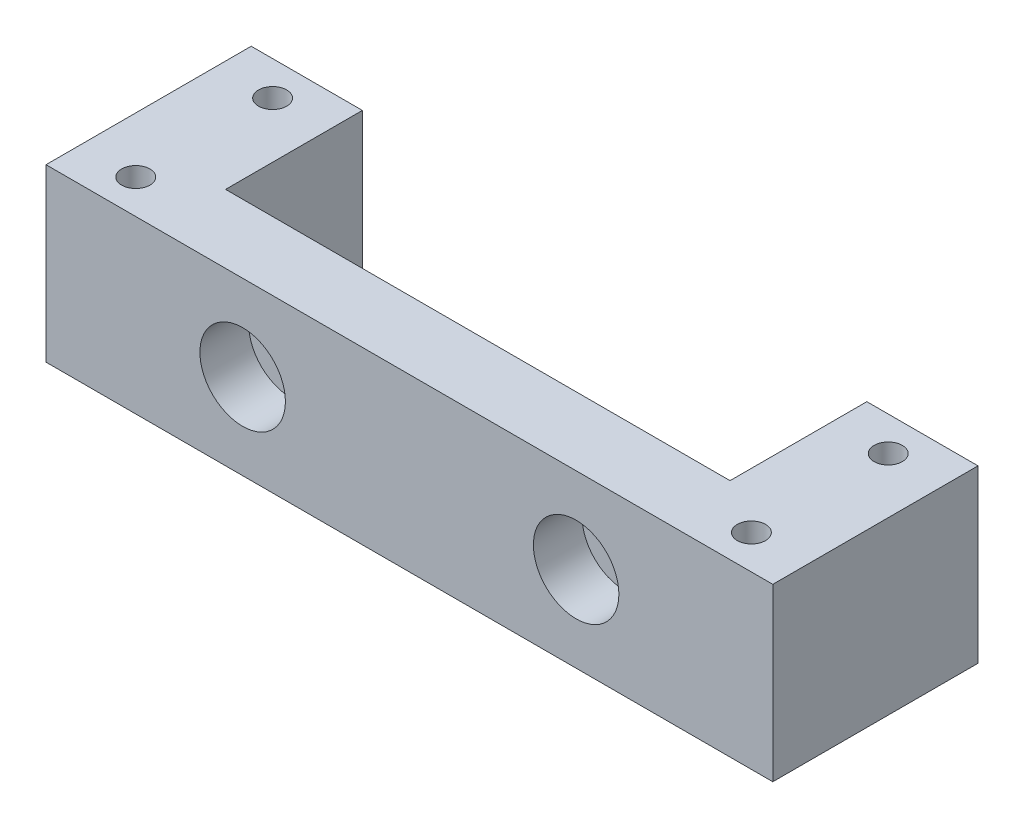
ISO-10303-21;
HEADER;
FILE_DESCRIPTION(('STEP AP214'),'2;1');
FILE_NAME('part.step','',(''),(''),'','','');
FILE_SCHEMA(('AUTOMOTIVE_DESIGN { 1 0 10303 214 1 1 1 1 }'));
ENDSEC;
DATA;
#1=APPLICATION_CONTEXT('core data for automotive mechanical design processes');
#2=APPLICATION_PROTOCOL_DEFINITION('international standard','automotive_design',2000,#1);
#3=PRODUCT_CONTEXT('',#1,'mechanical');
#4=PRODUCT('Part','Part','',(#3));
#5=PRODUCT_RELATED_PRODUCT_CATEGORY('part','',(#4));
#6=PRODUCT_DEFINITION_FORMATION('','',#4);
#7=PRODUCT_DEFINITION_CONTEXT('part definition',#1,'design');
#8=PRODUCT_DEFINITION('design','',#6,#7);
#9=PRODUCT_DEFINITION_SHAPE('','',#8);
#10=(LENGTH_UNIT() NAMED_UNIT(*) SI_UNIT(.MILLI.,.METRE.));
#11=(NAMED_UNIT(*) PLANE_ANGLE_UNIT() SI_UNIT($,.RADIAN.));
#12=(NAMED_UNIT(*) SI_UNIT($,.STERADIAN.) SOLID_ANGLE_UNIT());
#13=UNCERTAINTY_MEASURE_WITH_UNIT(LENGTH_MEASURE(1.E-05),#10,'distance_accuracy_value','');
#14=(GEOMETRIC_REPRESENTATION_CONTEXT(3) GLOBAL_UNCERTAINTY_ASSIGNED_CONTEXT((#13)) GLOBAL_UNIT_ASSIGNED_CONTEXT((#10,
#11,#12)) REPRESENTATION_CONTEXT('',''));
#15=CARTESIAN_POINT('',(0.,0.,0.));
#16=DIRECTION('',(0.,0.,1.));
#17=DIRECTION('',(1.,0.,0.));
#18=AXIS2_PLACEMENT_3D('',#15,#16,#17);
#19=CARTESIAN_POINT('',(0.,0.,0.));
#20=DIRECTION('',(0.,1.,0.));
#21=DIRECTION('',(0.,0.,1.));
#22=AXIS2_PLACEMENT_3D('',#19,#20,#21);
#23=PLANE('',#22);
#24=DIRECTION('',(0.,0.,-1.));
#25=VECTOR('',#24,1.);
#26=CARTESIAN_POINT('',(42.5000000000001,0.,-24.));
#27=LINE('',#26,#25);
#28=CARTESIAN_POINT('',(42.5000000000001,0.,0.));
#29=VERTEX_POINT('',#28);
#30=CARTESIAN_POINT('',(42.5000000000001,0.,-24.));
#31=VERTEX_POINT('',#30);
#32=EDGE_CURVE('E145',#29,#31,#27,.T.);
#33=ORIENTED_EDGE('',*,*,#32,.F.);
#34=DIRECTION('',(1.,0.,0.));
#35=VECTOR('',#34,1.);
#36=CARTESIAN_POINT('',(-42.5000000000001,0.,0.));
#37=LINE('',#36,#35);
#38=CARTESIAN_POINT('',(-42.5000000000001,0.,0.));
#39=VERTEX_POINT('',#38);
#40=EDGE_CURVE('E100',#39,#29,#37,.T.);
#41=ORIENTED_EDGE('',*,*,#40,.F.);
#42=DIRECTION('',(0.,0.,1.));
#43=VECTOR('',#42,1.);
#44=CARTESIAN_POINT('',(-42.5000000000001,0.,-24.));
#45=LINE('',#44,#43);
#46=CARTESIAN_POINT('',(-42.5000000000001,0.,-24.));
#47=VERTEX_POINT('',#46);
#48=EDGE_CURVE('E94',#47,#39,#45,.T.);
#49=ORIENTED_EDGE('',*,*,#48,.F.);
#50=DIRECTION('',(-1.,0.,0.));
#51=VECTOR('',#50,1.);
#52=CARTESIAN_POINT('',(-42.5000000000001,0.,-24.));
#53=LINE('',#52,#51);
#54=CARTESIAN_POINT('',(-29.5000000000001,0.,-24.));
#55=VERTEX_POINT('',#54);
#56=EDGE_CURVE('E135',#55,#47,#53,.T.);
#57=ORIENTED_EDGE('',*,*,#56,.F.);
#58=DIRECTION('',(0.,0.,-1.));
#59=VECTOR('',#58,1.);
#60=CARTESIAN_POINT('',(-29.5000000000001,0.,-8.00000000000001));
#61=LINE('',#60,#59);
#62=CARTESIAN_POINT('',(-29.5000000000001,0.,-8.00000000000001));
#63=VERTEX_POINT('',#62);
#64=EDGE_CURVE('E155',#63,#55,#61,.T.);
#65=ORIENTED_EDGE('',*,*,#64,.F.);
#66=DIRECTION('',(-1.,0.,0.));
#67=VECTOR('',#66,1.);
#68=CARTESIAN_POINT('',(-29.5000000000001,0.,-8.00000000000001));
#69=LINE('',#68,#67);
#70=CARTESIAN_POINT('',(29.5000000000001,0.,-8.));
#71=VERTEX_POINT('',#70);
#72=EDGE_CURVE('E153',#71,#63,#69,.T.);
#73=ORIENTED_EDGE('',*,*,#72,.F.);
#74=DIRECTION('',(0.,0.,1.));
#75=VECTOR('',#74,1.);
#76=CARTESIAN_POINT('',(29.5000000000001,0.,-8.));
#77=LINE('',#76,#75);
#78=CARTESIAN_POINT('',(29.5000000000001,0.,-24.));
#79=VERTEX_POINT('',#78);
#80=EDGE_CURVE('E151',#79,#71,#77,.T.);
#81=ORIENTED_EDGE('',*,*,#80,.F.);
#82=DIRECTION('',(-1.,0.,0.));
#83=VECTOR('',#82,1.);
#84=CARTESIAN_POINT('',(29.5000000000001,0.,-24.));
#85=LINE('',#84,#83);
#86=EDGE_CURVE('E148',#31,#79,#85,.T.);
#87=ORIENTED_EDGE('',*,*,#86,.F.);
#88=EDGE_LOOP('',(#33,#41,#49,#57,#65,#73,#81,#87));
#89=FACE_BOUND('',#88,.T.);
#90=CARTESIAN_POINT('',(36.0000000000001,0.,-20.));
#91=DIRECTION('',(0.,-1.,0.));
#92=DIRECTION('',(0.,0.,-1.));
#93=AXIS2_PLACEMENT_3D('',#90,#91,#92);
#94=CIRCLE('',#93,1.64999999999998);
#95=CARTESIAN_POINT('',(36.0000000000001,0.,-21.65));
#96=VERTEX_POINT('',#95);
#97=EDGE_CURVE('E219',#96,#96,#94,.T.);
#98=ORIENTED_EDGE('',*,*,#97,.F.);
#99=EDGE_LOOP('',(#98));
#100=FACE_BOUND('',#99,.T.);
#101=CARTESIAN_POINT('',(-36.0000000000001,0.,-20.));
#102=DIRECTION('',(0.,-1.,0.));
#103=DIRECTION('',(0.,0.,-1.));
#104=AXIS2_PLACEMENT_3D('',#101,#102,#103);
#105=CIRCLE('',#104,1.64999999999998);
#106=CARTESIAN_POINT('',(-36.0000000000001,0.,-21.65));
#107=VERTEX_POINT('',#106);
#108=EDGE_CURVE('E225',#107,#107,#105,.T.);
#109=ORIENTED_EDGE('',*,*,#108,.F.);
#110=EDGE_LOOP('',(#109));
#111=FACE_BOUND('',#110,.T.);
#112=CARTESIAN_POINT('',(36.0000000000001,0.,-4.));
#113=DIRECTION('',(0.,-1.,0.));
#114=DIRECTION('',(0.,0.,-1.));
#115=AXIS2_PLACEMENT_3D('',#112,#113,#114);
#116=CIRCLE('',#115,1.64999999999998);
#117=CARTESIAN_POINT('',(36.0000000000001,0.,-5.64999999999999));
#118=VERTEX_POINT('',#117);
#119=EDGE_CURVE('E231',#118,#118,#116,.T.);
#120=ORIENTED_EDGE('',*,*,#119,.F.);
#121=EDGE_LOOP('',(#120));
#122=FACE_BOUND('',#121,.T.);
#123=CARTESIAN_POINT('',(-36.0000000000001,0.,-4.00000000000004));
#124=DIRECTION('',(0.,-1.,0.));
#125=DIRECTION('',(0.,0.,-1.));
#126=AXIS2_PLACEMENT_3D('',#123,#124,#125);
#127=CIRCLE('',#126,1.64999999999998);
#128=CARTESIAN_POINT('',(-36.0000000000001,0.,-5.65000000000002));
#129=VERTEX_POINT('',#128);
#130=EDGE_CURVE('E237',#129,#129,#127,.T.);
#131=ORIENTED_EDGE('',*,*,#130,.F.);
#132=EDGE_LOOP('',(#131));
#133=FACE_BOUND('',#132,.T.);
#134=ADVANCED_FACE('F48',(#89,#100,#111,#122,#133),#23,.F.);
#135=CARTESIAN_POINT('',(42.5000000000001,20.0000000000001,-24.));
#136=DIRECTION('',(-1.,0.,0.));
#137=DIRECTION('',(0.,0.,1.));
#138=AXIS2_PLACEMENT_3D('',#135,#136,#137);
#139=PLANE('',#138);
#140=ORIENTED_EDGE('',*,*,#32,.T.);
#141=DIRECTION('',(0.,-1.,0.));
#142=VECTOR('',#141,1.);
#143=CARTESIAN_POINT('',(42.5000000000001,20.0000000000001,-24.));
#144=LINE('',#143,#142);
#145=CARTESIAN_POINT('',(42.5000000000001,20.0000000000001,-24.));
#146=VERTEX_POINT('',#145);
#147=EDGE_CURVE('E13',#146,#31,#144,.T.);
#148=ORIENTED_EDGE('',*,*,#147,.F.);
#149=DIRECTION('',(0.,0.,-1.));
#150=VECTOR('',#149,1.);
#151=CARTESIAN_POINT('',(42.5000000000001,20.0000000000001,-24.));
#152=LINE('',#151,#150);
#153=CARTESIAN_POINT('',(42.5000000000001,20.0000000000002,0.));
#154=VERTEX_POINT('',#153);
#155=EDGE_CURVE('E160',#154,#146,#152,.T.);
#156=ORIENTED_EDGE('',*,*,#155,.F.);
#157=DIRECTION('',(0.,-1.,0.));
#158=VECTOR('',#157,1.);
#159=CARTESIAN_POINT('',(42.5000000000001,20.0000000000002,0.));
#160=LINE('',#159,#158);
#161=EDGE_CURVE('E141',#154,#29,#160,.T.);
#162=ORIENTED_EDGE('',*,*,#161,.T.);
#163=EDGE_LOOP('',(#140,#148,#156,#162));
#164=FACE_BOUND('',#163,.T.);
#165=ADVANCED_FACE('F50',(#164),#139,.F.);
#166=CARTESIAN_POINT('',(29.5000000000001,20.0000000000001,-24.));
#167=DIRECTION('',(0.,0.,1.));
#168=DIRECTION('',(1.,0.,0.));
#169=AXIS2_PLACEMENT_3D('',#166,#167,#168);
#170=PLANE('',#169);
#171=ORIENTED_EDGE('',*,*,#86,.T.);
#172=DIRECTION('',(0.,-1.,0.));
#173=VECTOR('',#172,1.);
#174=CARTESIAN_POINT('',(29.5000000000001,20.0000000000001,-24.));
#175=LINE('',#174,#173);
#176=CARTESIAN_POINT('',(29.5000000000001,20.0000000000001,-24.));
#177=VERTEX_POINT('',#176);
#178=EDGE_CURVE('E57',#177,#79,#175,.T.);
#179=ORIENTED_EDGE('',*,*,#178,.F.);
#180=DIRECTION('',(-1.,0.,0.));
#181=VECTOR('',#180,1.);
#182=CARTESIAN_POINT('',(29.5000000000001,20.0000000000001,-24.));
#183=LINE('',#182,#181);
#184=EDGE_CURVE('E108',#146,#177,#183,.T.);
#185=ORIENTED_EDGE('',*,*,#184,.F.);
#186=ORIENTED_EDGE('',*,*,#147,.T.);
#187=EDGE_LOOP('',(#171,#179,#185,#186));
#188=FACE_BOUND('',#187,.T.);
#189=ADVANCED_FACE('F249',(#188),#170,.F.);
#190=CARTESIAN_POINT('',(29.5000000000001,20.0000000000002,-8.00000000000004));
#191=DIRECTION('',(1.,0.,0.));
#192=DIRECTION('',(0.,0.,-1.));
#193=AXIS2_PLACEMENT_3D('',#190,#191,#192);
#194=PLANE('',#193);
#195=ORIENTED_EDGE('',*,*,#80,.T.);
#196=DIRECTION('',(0.,-1.,0.));
#197=VECTOR('',#196,1.);
#198=CARTESIAN_POINT('',(29.5000000000001,20.0000000000002,-8.00000000000004));
#199=LINE('',#198,#197);
#200=CARTESIAN_POINT('',(29.5000000000001,20.0000000000002,-8.00000000000004));
#201=VERTEX_POINT('',#200);
#202=EDGE_CURVE('E167',#201,#71,#199,.T.);
#203=ORIENTED_EDGE('',*,*,#202,.F.);
#204=DIRECTION('',(0.,0.,1.));
#205=VECTOR('',#204,1.);
#206=CARTESIAN_POINT('',(29.5000000000001,20.0000000000002,-8.00000000000004));
#207=LINE('',#206,#205);
#208=EDGE_CURVE('E175',#177,#201,#207,.T.);
#209=ORIENTED_EDGE('',*,*,#208,.F.);
#210=ORIENTED_EDGE('',*,*,#178,.T.);
#211=EDGE_LOOP('',(#195,#203,#209,#210));
#212=FACE_BOUND('',#211,.T.);
#213=ADVANCED_FACE('F173',(#212),#194,.F.);
#214=CARTESIAN_POINT('',(-29.5000000000001,20.0000000000001,-8.00000000000004));
#215=DIRECTION('',(0.,0.,1.));
#216=DIRECTION('',(1.,0.,0.));
#217=AXIS2_PLACEMENT_3D('',#214,#215,#216);
#218=PLANE('',#217);
#219=CARTESIAN_POINT('',(19.5000000000001,9.99999999999999,-8.00000000000004));
#220=DIRECTION('',(0.,0.,1.));
#221=DIRECTION('',(1.,0.,0.));
#222=AXIS2_PLACEMENT_3D('',#219,#220,#221);
#223=CIRCLE('',#222,2.75);
#224=CARTESIAN_POINT('',(22.2500000000001,10.,-8.00000000000004));
#225=VERTEX_POINT('',#224);
#226=EDGE_CURVE('E204',#225,#225,#223,.T.);
#227=ORIENTED_EDGE('',*,*,#226,.T.);
#228=EDGE_LOOP('',(#227));
#229=FACE_BOUND('',#228,.T.);
#230=CARTESIAN_POINT('',(-19.5,9.99999999999998,-8.00000000000001));
#231=DIRECTION('',(0.,0.,1.));
#232=DIRECTION('',(1.,0.,0.));
#233=AXIS2_PLACEMENT_3D('',#230,#231,#232);
#234=CIRCLE('',#233,2.75);
#235=CARTESIAN_POINT('',(-16.75,9.99999999999998,-8.00000000000001));
#236=VERTEX_POINT('',#235);
#237=EDGE_CURVE('E149',#236,#236,#234,.T.);
#238=ORIENTED_EDGE('',*,*,#237,.T.);
#239=EDGE_LOOP('',(#238));
#240=FACE_BOUND('',#239,.T.);
#241=ORIENTED_EDGE('',*,*,#72,.T.);
#242=DIRECTION('',(0.,-1.,0.));
#243=VECTOR('',#242,1.);
#244=CARTESIAN_POINT('',(-29.5000000000001,20.0000000000001,-8.00000000000004));
#245=LINE('',#244,#243);
#246=CARTESIAN_POINT('',(-29.5000000000001,20.0000000000001,-8.00000000000004));
#247=VERTEX_POINT('',#246);
#248=EDGE_CURVE('E164',#247,#63,#245,.T.);
#249=ORIENTED_EDGE('',*,*,#248,.F.);
#250=DIRECTION('',(-1.,0.,0.));
#251=VECTOR('',#250,1.);
#252=CARTESIAN_POINT('',(-29.5000000000001,20.0000000000001,-8.00000000000004));
#253=LINE('',#252,#251);
#254=EDGE_CURVE('E187',#201,#247,#253,.T.);
#255=ORIENTED_EDGE('',*,*,#254,.F.);
#256=ORIENTED_EDGE('',*,*,#202,.T.);
#257=EDGE_LOOP('',(#241,#249,#255,#256));
#258=FACE_BOUND('',#257,.T.);
#259=ADVANCED_FACE('F183',(#229,#240,#258),#218,.F.);
#260=CARTESIAN_POINT('',(-29.5000000000001,20.0000000000001,-8.00000000000004));
#261=DIRECTION('',(-1.,0.,0.));
#262=DIRECTION('',(0.,0.,1.));
#263=AXIS2_PLACEMENT_3D('',#260,#261,#262);
#264=PLANE('',#263);
#265=ORIENTED_EDGE('',*,*,#64,.T.);
#266=DIRECTION('',(0.,-1.,0.));
#267=VECTOR('',#266,1.);
#268=CARTESIAN_POINT('',(-29.5000000000001,20.0000000000001,-24.));
#269=LINE('',#268,#267);
#270=CARTESIAN_POINT('',(-29.5000000000001,20.0000000000001,-24.));
#271=VERTEX_POINT('',#270);
#272=EDGE_CURVE('E136',#271,#55,#269,.T.);
#273=ORIENTED_EDGE('',*,*,#272,.F.);
#274=DIRECTION('',(0.,0.,-1.));
#275=VECTOR('',#274,1.);
#276=CARTESIAN_POINT('',(-29.5000000000001,20.0000000000001,-8.00000000000004));
#277=LINE('',#276,#275);
#278=EDGE_CURVE('E127',#247,#271,#277,.T.);
#279=ORIENTED_EDGE('',*,*,#278,.F.);
#280=ORIENTED_EDGE('',*,*,#248,.T.);
#281=EDGE_LOOP('',(#265,#273,#279,#280));
#282=FACE_BOUND('',#281,.T.);
#283=ADVANCED_FACE('F186',(#282),#264,.F.);
#284=CARTESIAN_POINT('',(-42.5000000000001,20.0000000000001,-24.));
#285=DIRECTION('',(0.,0.,1.));
#286=DIRECTION('',(1.,0.,0.));
#287=AXIS2_PLACEMENT_3D('',#284,#285,#286);
#288=PLANE('',#287);
#289=ORIENTED_EDGE('',*,*,#56,.T.);
#290=DIRECTION('',(0.,-1.,0.));
#291=VECTOR('',#290,1.);
#292=CARTESIAN_POINT('',(-42.5000000000001,20.0000000000001,-24.));
#293=LINE('',#292,#291);
#294=CARTESIAN_POINT('',(-42.5000000000001,20.0000000000001,-24.));
#295=VERTEX_POINT('',#294);
#296=EDGE_CURVE('E132',#295,#47,#293,.T.);
#297=ORIENTED_EDGE('',*,*,#296,.F.);
#298=DIRECTION('',(-1.,0.,0.));
#299=VECTOR('',#298,1.);
#300=CARTESIAN_POINT('',(-42.5000000000001,20.0000000000001,-24.));
#301=LINE('',#300,#299);
#302=EDGE_CURVE('E121',#271,#295,#301,.T.);
#303=ORIENTED_EDGE('',*,*,#302,.F.);
#304=ORIENTED_EDGE('',*,*,#272,.T.);
#305=EDGE_LOOP('',(#289,#297,#303,#304));
#306=FACE_BOUND('',#305,.T.);
#307=ADVANCED_FACE('F133',(#306),#288,.F.);
#308=CARTESIAN_POINT('',(-42.5000000000001,20.0000000000001,-24.));
#309=DIRECTION('',(1.,0.,0.));
#310=DIRECTION('',(0.,0.,-1.));
#311=AXIS2_PLACEMENT_3D('',#308,#309,#310);
#312=PLANE('',#311);
#313=ORIENTED_EDGE('',*,*,#48,.T.);
#314=DIRECTION('',(0.,-1.,0.));
#315=VECTOR('',#314,1.);
#316=CARTESIAN_POINT('',(-42.5000000000001,20.0000000000001,0.));
#317=LINE('',#316,#315);
#318=CARTESIAN_POINT('',(-42.5000000000001,20.0000000000001,0.));
#319=VERTEX_POINT('',#318);
#320=EDGE_CURVE('E137',#319,#39,#317,.T.);
#321=ORIENTED_EDGE('',*,*,#320,.F.);
#322=DIRECTION('',(0.,0.,1.));
#323=VECTOR('',#322,1.);
#324=CARTESIAN_POINT('',(-42.5000000000001,20.0000000000001,-24.));
#325=LINE('',#324,#323);
#326=EDGE_CURVE('E125',#295,#319,#325,.T.);
#327=ORIENTED_EDGE('',*,*,#326,.F.);
#328=ORIENTED_EDGE('',*,*,#296,.T.);
#329=EDGE_LOOP('',(#313,#321,#327,#328));
#330=FACE_BOUND('',#329,.T.);
#331=ADVANCED_FACE('F139',(#330),#312,.F.);
#332=CARTESIAN_POINT('',(-42.5000000000001,20.0000000000001,0.));
#333=DIRECTION('',(0.,0.,-1.));
#334=DIRECTION('',(-1.,0.,0.));
#335=AXIS2_PLACEMENT_3D('',#332,#333,#334);
#336=PLANE('',#335);
#337=CARTESIAN_POINT('',(19.5000000000001,9.99999999999999,0.));
#338=DIRECTION('',(0.,0.,1.));
#339=DIRECTION('',(1.,0.,0.));
#340=AXIS2_PLACEMENT_3D('',#337,#338,#339);
#341=CIRCLE('',#340,5.);
#342=CARTESIAN_POINT('',(24.5000000000001,10.,0.));
#343=VERTEX_POINT('',#342);
#344=EDGE_CURVE('E213',#343,#343,#341,.T.);
#345=ORIENTED_EDGE('',*,*,#344,.F.);
#346=EDGE_LOOP('',(#345));
#347=FACE_BOUND('',#346,.T.);
#348=CARTESIAN_POINT('',(-19.5,9.99999999999998,0.));
#349=DIRECTION('',(0.,0.,1.));
#350=DIRECTION('',(1.,0.,0.));
#351=AXIS2_PLACEMENT_3D('',#348,#349,#350);
#352=CIRCLE('',#351,5.);
#353=CARTESIAN_POINT('',(-14.5,9.99999999999998,0.));
#354=VERTEX_POINT('',#353);
#355=EDGE_CURVE('E201',#354,#354,#352,.T.);
#356=ORIENTED_EDGE('',*,*,#355,.F.);
#357=EDGE_LOOP('',(#356));
#358=FACE_BOUND('',#357,.T.);
#359=ORIENTED_EDGE('',*,*,#40,.T.);
#360=ORIENTED_EDGE('',*,*,#161,.F.);
#361=DIRECTION('',(1.,0.,0.));
#362=VECTOR('',#361,1.);
#363=CARTESIAN_POINT('',(-42.5000000000001,20.0000000000001,0.));
#364=LINE('',#363,#362);
#365=EDGE_CURVE('E65',#319,#154,#364,.T.);
#366=ORIENTED_EDGE('',*,*,#365,.F.);
#367=ORIENTED_EDGE('',*,*,#320,.T.);
#368=EDGE_LOOP('',(#359,#360,#366,#367));
#369=FACE_BOUND('',#368,.T.);
#370=ADVANCED_FACE('F254',(#347,#358,#369),#336,.F.);
#371=CARTESIAN_POINT('',(0.,20.0000000000001,0.));
#372=DIRECTION('',(0.,1.,0.));
#373=DIRECTION('',(0.,0.,1.));
#374=AXIS2_PLACEMENT_3D('',#371,#372,#373);
#375=PLANE('',#374);
#376=CARTESIAN_POINT('',(-36.0000000000001,20.0000000000001,-4.00000000000004));
#377=DIRECTION('',(0.,1.,0.));
#378=DIRECTION('',(0.,0.,1.));
#379=AXIS2_PLACEMENT_3D('',#376,#377,#378);
#380=CIRCLE('',#379,1.64999999999999);
#381=CARTESIAN_POINT('',(-36.0000000000001,20.0000000000001,-2.35000000000005));
#382=VERTEX_POINT('',#381);
#383=EDGE_CURVE('E234',#382,#382,#380,.T.);
#384=ORIENTED_EDGE('',*,*,#383,.F.);
#385=EDGE_LOOP('',(#384));
#386=FACE_BOUND('',#385,.T.);
#387=CARTESIAN_POINT('',(36.0000000000001,20.0000000000002,-4.00000000000004));
#388=DIRECTION('',(0.,1.,0.));
#389=DIRECTION('',(0.,0.,1.));
#390=AXIS2_PLACEMENT_3D('',#387,#388,#389);
#391=CIRCLE('',#390,1.64999999999999);
#392=CARTESIAN_POINT('',(36.0000000000001,20.0000000000002,-2.35000000000005));
#393=VERTEX_POINT('',#392);
#394=EDGE_CURVE('E228',#393,#393,#391,.T.);
#395=ORIENTED_EDGE('',*,*,#394,.F.);
#396=EDGE_LOOP('',(#395));
#397=FACE_BOUND('',#396,.T.);
#398=CARTESIAN_POINT('',(-36.0000000000001,20.0000000000001,-20.));
#399=DIRECTION('',(0.,1.,0.));
#400=DIRECTION('',(0.,0.,1.));
#401=AXIS2_PLACEMENT_3D('',#398,#399,#400);
#402=CIRCLE('',#401,1.64999999999999);
#403=CARTESIAN_POINT('',(-36.0000000000001,20.0000000000001,-18.35));
#404=VERTEX_POINT('',#403);
#405=EDGE_CURVE('E222',#404,#404,#402,.T.);
#406=ORIENTED_EDGE('',*,*,#405,.F.);
#407=EDGE_LOOP('',(#406));
#408=FACE_BOUND('',#407,.T.);
#409=CARTESIAN_POINT('',(36.0000000000001,20.0000000000001,-20.));
#410=DIRECTION('',(0.,1.,0.));
#411=DIRECTION('',(0.,0.,1.));
#412=AXIS2_PLACEMENT_3D('',#409,#410,#411);
#413=CIRCLE('',#412,1.64999999999999);
#414=CARTESIAN_POINT('',(36.0000000000001,20.0000000000001,-18.35));
#415=VERTEX_POINT('',#414);
#416=EDGE_CURVE('E216',#415,#415,#413,.T.);
#417=ORIENTED_EDGE('',*,*,#416,.F.);
#418=EDGE_LOOP('',(#417));
#419=FACE_BOUND('',#418,.T.);
#420=ORIENTED_EDGE('',*,*,#155,.T.);
#421=ORIENTED_EDGE('',*,*,#184,.T.);
#422=ORIENTED_EDGE('',*,*,#208,.T.);
#423=ORIENTED_EDGE('',*,*,#254,.T.);
#424=ORIENTED_EDGE('',*,*,#278,.T.);
#425=ORIENTED_EDGE('',*,*,#302,.T.);
#426=ORIENTED_EDGE('',*,*,#326,.T.);
#427=ORIENTED_EDGE('',*,*,#365,.T.);
#428=EDGE_LOOP('',(#420,#421,#422,#423,#424,#425,#426,#427));
#429=FACE_BOUND('',#428,.T.);
#430=ADVANCED_FACE('F123',(#386,#397,#408,#419,#429),#375,.T.);
#431=CARTESIAN_POINT('',(-19.5,9.99999999999998,0.));
#432=DIRECTION('',(0.,0.,1.));
#433=DIRECTION('',(1.,0.,0.));
#434=AXIS2_PLACEMENT_3D('',#431,#432,#433);
#435=CYLINDRICAL_SURFACE('',#434,2.75);
#436=ORIENTED_EDGE('',*,*,#237,.F.);
#437=EDGE_LOOP('',(#436));
#438=FACE_BOUND('',#437,.T.);
#439=CARTESIAN_POINT('',(-19.5,9.99999999999998,-5.70000000000001));
#440=DIRECTION('',(0.,0.,1.));
#441=DIRECTION('',(1.,0.,0.));
#442=AXIS2_PLACEMENT_3D('',#439,#440,#441);
#443=CIRCLE('',#442,2.75);
#444=CARTESIAN_POINT('',(-16.75,9.99999999999998,-5.70000000000001));
#445=VERTEX_POINT('',#444);
#446=EDGE_CURVE('E195',#445,#445,#443,.T.);
#447=ORIENTED_EDGE('',*,*,#446,.T.);
#448=EDGE_LOOP('',(#447));
#449=FACE_BOUND('',#448,.T.);
#450=ADVANCED_FACE('F305',(#438,#449),#435,.F.);
#451=CARTESIAN_POINT('',(-16.75,9.99999999999998,-5.7));
#452=DIRECTION('',(0.,0.,-1.));
#453=DIRECTION('',(-1.,0.,0.));
#454=AXIS2_PLACEMENT_3D('',#451,#452,#453);
#455=PLANE('',#454);
#456=ORIENTED_EDGE('',*,*,#446,.F.);
#457=EDGE_LOOP('',(#456));
#458=FACE_BOUND('',#457,.T.);
#459=CARTESIAN_POINT('',(-19.5,9.99999999999998,-5.70000000000001));
#460=DIRECTION('',(0.,0.,1.));
#461=DIRECTION('',(1.,0.,0.));
#462=AXIS2_PLACEMENT_3D('',#459,#460,#461);
#463=CIRCLE('',#462,5.);
#464=CARTESIAN_POINT('',(-14.5,9.99999999999998,-5.70000000000001));
#465=VERTEX_POINT('',#464);
#466=EDGE_CURVE('E198',#465,#465,#463,.T.);
#467=ORIENTED_EDGE('',*,*,#466,.T.);
#468=EDGE_LOOP('',(#467));
#469=FACE_BOUND('',#468,.T.);
#470=ADVANCED_FACE('F312',(#458,#469),#455,.F.);
#471=CARTESIAN_POINT('',(-19.5,9.99999999999998,0.));
#472=DIRECTION('',(0.,0.,1.));
#473=DIRECTION('',(1.,0.,0.));
#474=AXIS2_PLACEMENT_3D('',#471,#472,#473);
#475=CYLINDRICAL_SURFACE('',#474,5.);
#476=ORIENTED_EDGE('',*,*,#466,.F.);
#477=EDGE_LOOP('',(#476));
#478=FACE_BOUND('',#477,.T.);
#479=ORIENTED_EDGE('',*,*,#355,.T.);
#480=EDGE_LOOP('',(#479));
#481=FACE_BOUND('',#480,.T.);
#482=ADVANCED_FACE('F319',(#478,#481),#475,.F.);
#483=CARTESIAN_POINT('',(19.5000000000001,9.99999999999999,0.));
#484=DIRECTION('',(0.,0.,1.));
#485=DIRECTION('',(1.,0.,0.));
#486=AXIS2_PLACEMENT_3D('',#483,#484,#485);
#487=CYLINDRICAL_SURFACE('',#486,2.75);
#488=ORIENTED_EDGE('',*,*,#226,.F.);
#489=EDGE_LOOP('',(#488));
#490=FACE_BOUND('',#489,.T.);
#491=CARTESIAN_POINT('',(19.5000000000001,9.99999999999999,-5.70000000000004));
#492=DIRECTION('',(0.,0.,1.));
#493=DIRECTION('',(1.,0.,0.));
#494=AXIS2_PLACEMENT_3D('',#491,#492,#493);
#495=CIRCLE('',#494,2.75);
#496=CARTESIAN_POINT('',(22.2500000000001,10.,-5.70000000000004));
#497=VERTEX_POINT('',#496);
#498=EDGE_CURVE('E207',#497,#497,#495,.T.);
#499=ORIENTED_EDGE('',*,*,#498,.T.);
#500=EDGE_LOOP('',(#499));
#501=FACE_BOUND('',#500,.T.);
#502=ADVANCED_FACE('F327',(#490,#501),#487,.F.);
#503=CARTESIAN_POINT('',(22.2500000000001,9.99999999999999,-5.70000000000004));
#504=DIRECTION('',(0.,0.,-1.));
#505=DIRECTION('',(-1.,0.,0.));
#506=AXIS2_PLACEMENT_3D('',#503,#504,#505);
#507=PLANE('',#506);
#508=ORIENTED_EDGE('',*,*,#498,.F.);
#509=EDGE_LOOP('',(#508));
#510=FACE_BOUND('',#509,.T.);
#511=CARTESIAN_POINT('',(19.5000000000001,9.99999999999999,-5.70000000000004));
#512=DIRECTION('',(0.,0.,1.));
#513=DIRECTION('',(1.,0.,0.));
#514=AXIS2_PLACEMENT_3D('',#511,#512,#513);
#515=CIRCLE('',#514,5.);
#516=CARTESIAN_POINT('',(24.5000000000001,10.,-5.70000000000004));
#517=VERTEX_POINT('',#516);
#518=EDGE_CURVE('E210',#517,#517,#515,.T.);
#519=ORIENTED_EDGE('',*,*,#518,.T.);
#520=EDGE_LOOP('',(#519));
#521=FACE_BOUND('',#520,.T.);
#522=ADVANCED_FACE('F335',(#510,#521),#507,.F.);
#523=CARTESIAN_POINT('',(19.5000000000001,9.99999999999999,0.));
#524=DIRECTION('',(0.,0.,1.));
#525=DIRECTION('',(1.,0.,0.));
#526=AXIS2_PLACEMENT_3D('',#523,#524,#525);
#527=CYLINDRICAL_SURFACE('',#526,5.);
#528=ORIENTED_EDGE('',*,*,#518,.F.);
#529=EDGE_LOOP('',(#528));
#530=FACE_BOUND('',#529,.T.);
#531=ORIENTED_EDGE('',*,*,#344,.T.);
#532=EDGE_LOOP('',(#531));
#533=FACE_BOUND('',#532,.T.);
#534=ADVANCED_FACE('F343',(#530,#533),#527,.F.);
#535=CARTESIAN_POINT('',(36.0000000000001,0.,-20.));
#536=DIRECTION('',(0.,-1.,0.));
#537=DIRECTION('',(0.,0.,-1.));
#538=AXIS2_PLACEMENT_3D('',#535,#536,#537);
#539=CYLINDRICAL_SURFACE('',#538,1.64999999999999);
#540=ORIENTED_EDGE('',*,*,#97,.T.);
#541=EDGE_LOOP('',(#540));
#542=FACE_BOUND('',#541,.T.);
#543=ORIENTED_EDGE('',*,*,#416,.T.);
#544=EDGE_LOOP('',(#543));
#545=FACE_BOUND('',#544,.T.);
#546=ADVANCED_FACE('F351',(#542,#545),#539,.F.);
#547=CARTESIAN_POINT('',(-36.0000000000001,0.,-20.));
#548=DIRECTION('',(0.,-1.,0.));
#549=DIRECTION('',(0.,0.,-1.));
#550=AXIS2_PLACEMENT_3D('',#547,#548,#549);
#551=CYLINDRICAL_SURFACE('',#550,1.64999999999999);
#552=ORIENTED_EDGE('',*,*,#108,.T.);
#553=EDGE_LOOP('',(#552));
#554=FACE_BOUND('',#553,.T.);
#555=ORIENTED_EDGE('',*,*,#405,.T.);
#556=EDGE_LOOP('',(#555));
#557=FACE_BOUND('',#556,.T.);
#558=ADVANCED_FACE('F359',(#554,#557),#551,.F.);
#559=CARTESIAN_POINT('',(36.0000000000001,0.,-4.));
#560=DIRECTION('',(0.,-1.,0.));
#561=DIRECTION('',(0.,0.,-1.));
#562=AXIS2_PLACEMENT_3D('',#559,#560,#561);
#563=CYLINDRICAL_SURFACE('',#562,1.64999999999999);
#564=ORIENTED_EDGE('',*,*,#119,.T.);
#565=EDGE_LOOP('',(#564));
#566=FACE_BOUND('',#565,.T.);
#567=ORIENTED_EDGE('',*,*,#394,.T.);
#568=EDGE_LOOP('',(#567));
#569=FACE_BOUND('',#568,.T.);
#570=ADVANCED_FACE('F368',(#566,#569),#563,.F.);
#571=CARTESIAN_POINT('',(-36.0000000000001,0.,-4.00000000000004));
#572=DIRECTION('',(0.,-1.,0.));
#573=DIRECTION('',(0.,0.,-1.));
#574=AXIS2_PLACEMENT_3D('',#571,#572,#573);
#575=CYLINDRICAL_SURFACE('',#574,1.64999999999999);
#576=ORIENTED_EDGE('',*,*,#130,.T.);
#577=EDGE_LOOP('',(#576));
#578=FACE_BOUND('',#577,.T.);
#579=ORIENTED_EDGE('',*,*,#383,.T.);
#580=EDGE_LOOP('',(#579));
#581=FACE_BOUND('',#580,.T.);
#582=ADVANCED_FACE('F241',(#578,#581),#575,.F.);
#583=CLOSED_SHELL('',(#134,#165,#189,#213,#259,#283,#307,#331,#370,#430,#450,#470,#482,#502,
#522,#534,#546,#558,#570,#582));
#584=MANIFOLD_SOLID_BREP('B2',#583);
#585=ADVANCED_BREP_SHAPE_REPRESENTATION('',(#18,#584),#14);
#586=SHAPE_DEFINITION_REPRESENTATION(#9,#585);
ENDSEC;
END-ISO-10303-21;
